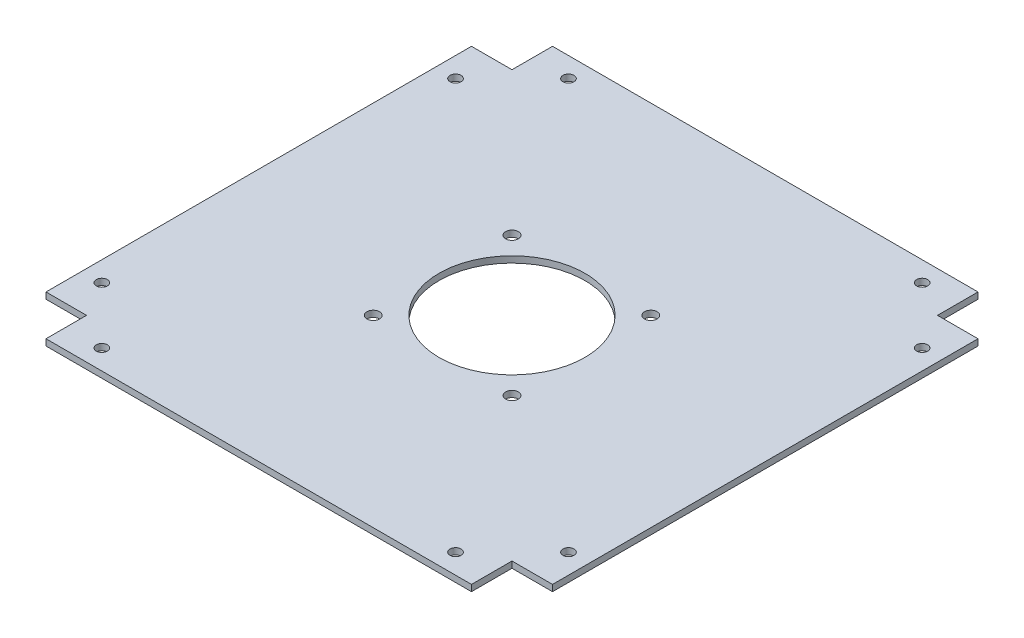
ISO-10303-21;
HEADER;
FILE_DESCRIPTION(('STEP AP214'),'2;1');
FILE_NAME('part.step','',(''),(''),'','','');
FILE_SCHEMA(('AUTOMOTIVE_DESIGN { 1 0 10303 214 1 1 1 1 }'));
ENDSEC;
DATA;
#1=APPLICATION_CONTEXT('core data for automotive mechanical design processes');
#2=APPLICATION_PROTOCOL_DEFINITION('international standard','automotive_design',2000,#1);
#3=PRODUCT_CONTEXT('',#1,'mechanical');
#4=PRODUCT('Part','Part','',(#3));
#5=PRODUCT_RELATED_PRODUCT_CATEGORY('part','',(#4));
#6=PRODUCT_DEFINITION_FORMATION('','',#4);
#7=PRODUCT_DEFINITION_CONTEXT('part definition',#1,'design');
#8=PRODUCT_DEFINITION('design','',#6,#7);
#9=PRODUCT_DEFINITION_SHAPE('','',#8);
#10=(LENGTH_UNIT() NAMED_UNIT(*) SI_UNIT(.MILLI.,.METRE.));
#11=(NAMED_UNIT(*) PLANE_ANGLE_UNIT() SI_UNIT($,.RADIAN.));
#12=(NAMED_UNIT(*) SI_UNIT($,.STERADIAN.) SOLID_ANGLE_UNIT());
#13=UNCERTAINTY_MEASURE_WITH_UNIT(LENGTH_MEASURE(1.E-05),#10,'distance_accuracy_value','');
#14=(GEOMETRIC_REPRESENTATION_CONTEXT(3) GLOBAL_UNCERTAINTY_ASSIGNED_CONTEXT((#13)) GLOBAL_UNIT_ASSIGNED_CONTEXT((#10,
#11,#12)) REPRESENTATION_CONTEXT('',''));
#15=CARTESIAN_POINT('',(0.,0.,0.));
#16=DIRECTION('',(0.,0.,1.));
#17=DIRECTION('',(1.,0.,0.));
#18=AXIS2_PLACEMENT_3D('',#15,#16,#17);
#19=CARTESIAN_POINT('',(127.,1.5875,127.));
#20=DIRECTION('',(-1.,0.,0.));
#21=DIRECTION('',(0.,0.,1.));
#22=AXIS2_PLACEMENT_3D('',#19,#20,#21);
#23=PLANE('',#22);
#24=DIRECTION('',(0.,0.,-1.));
#25=VECTOR('',#24,1.);
#26=CARTESIAN_POINT('',(127.,1.5875,127.));
#27=LINE('',#26,#25);
#28=CARTESIAN_POINT('',(126.999999999999,1.5875,106.680000000001));
#29=VERTEX_POINT('',#28);
#30=CARTESIAN_POINT('',(126.999999999999,1.5875,-106.680000000001));
#31=VERTEX_POINT('',#30);
#32=EDGE_CURVE('E165',#29,#31,#27,.T.);
#33=ORIENTED_EDGE('',*,*,#32,.F.);
#34=DIRECTION('',(0.,1.,0.));
#35=VECTOR('',#34,1.);
#36=CARTESIAN_POINT('',(126.999999999999,-1.5875,106.680000000001));
#37=LINE('',#36,#35);
#38=CARTESIAN_POINT('',(126.999999999999,-1.5875,106.680000000001));
#39=VERTEX_POINT('',#38);
#40=EDGE_CURVE('E149',#39,#29,#37,.T.);
#41=ORIENTED_EDGE('',*,*,#40,.F.);
#42=DIRECTION('',(0.,0.,-1.));
#43=VECTOR('',#42,1.);
#44=CARTESIAN_POINT('',(127.,-1.5875,127.));
#45=LINE('',#44,#43);
#46=CARTESIAN_POINT('',(126.999999999999,-1.5875,-106.680000000001));
#47=VERTEX_POINT('',#46);
#48=EDGE_CURVE('E144',#39,#47,#45,.T.);
#49=ORIENTED_EDGE('',*,*,#48,.T.);
#50=DIRECTION('',(0.,1.,0.));
#51=VECTOR('',#50,1.);
#52=CARTESIAN_POINT('',(126.999999999999,-1.5875,-106.680000000001));
#53=LINE('',#52,#51);
#54=EDGE_CURVE('E125',#47,#31,#53,.T.);
#55=ORIENTED_EDGE('',*,*,#54,.T.);
#56=EDGE_LOOP('',(#33,#41,#49,#55));
#57=FACE_BOUND('',#56,.T.);
#58=ADVANCED_FACE('F36',(#57),#23,.F.);
#59=CARTESIAN_POINT('',(-127.,1.5875,-127.));
#60=DIRECTION('',(0.,0.,1.));
#61=DIRECTION('',(1.,0.,0.));
#62=AXIS2_PLACEMENT_3D('',#59,#60,#61);
#63=PLANE('',#62);
#64=DIRECTION('',(-1.,0.,0.));
#65=VECTOR('',#64,1.);
#66=CARTESIAN_POINT('',(-127.,1.5875,-127.));
#67=LINE('',#66,#65);
#68=CARTESIAN_POINT('',(106.679999999999,1.5875,-127.000000000001));
#69=VERTEX_POINT('',#68);
#70=CARTESIAN_POINT('',(-106.68,1.5875,-127.));
#71=VERTEX_POINT('',#70);
#72=EDGE_CURVE('E170',#69,#71,#67,.T.);
#73=ORIENTED_EDGE('',*,*,#72,.F.);
#74=DIRECTION('',(0.,1.,0.));
#75=VECTOR('',#74,1.);
#76=CARTESIAN_POINT('',(106.679999999999,-1.5875,-127.000000000001));
#77=LINE('',#76,#75);
#78=CARTESIAN_POINT('',(106.679999999999,-1.5875,-127.000000000001));
#79=VERTEX_POINT('',#78);
#80=EDGE_CURVE('E136',#79,#69,#77,.T.);
#81=ORIENTED_EDGE('',*,*,#80,.F.);
#82=DIRECTION('',(-1.,0.,0.));
#83=VECTOR('',#82,1.);
#84=CARTESIAN_POINT('',(-127.,-1.5875,-127.));
#85=LINE('',#84,#83);
#86=CARTESIAN_POINT('',(-106.68,-1.5875,-127.));
#87=VERTEX_POINT('',#86);
#88=EDGE_CURVE('E150',#79,#87,#85,.T.);
#89=ORIENTED_EDGE('',*,*,#88,.T.);
#90=DIRECTION('',(0.,1.,0.));
#91=VECTOR('',#90,1.);
#92=CARTESIAN_POINT('',(-106.68,-1.5875,-127.));
#93=LINE('',#92,#91);
#94=EDGE_CURVE('E177',#87,#71,#93,.T.);
#95=ORIENTED_EDGE('',*,*,#94,.T.);
#96=EDGE_LOOP('',(#73,#81,#89,#95));
#97=FACE_BOUND('',#96,.T.);
#98=ADVANCED_FACE('F216',(#97),#63,.F.);
#99=CARTESIAN_POINT('',(-127.,1.5875,127.));
#100=DIRECTION('',(1.,0.,0.));
#101=DIRECTION('',(0.,0.,-1.));
#102=AXIS2_PLACEMENT_3D('',#99,#100,#101);
#103=PLANE('',#102);
#104=DIRECTION('',(0.,0.,1.));
#105=VECTOR('',#104,1.);
#106=CARTESIAN_POINT('',(-127.,-1.5875,127.));
#107=LINE('',#106,#105);
#108=CARTESIAN_POINT('',(-127.,-1.5875,-106.68));
#109=VERTEX_POINT('',#108);
#110=CARTESIAN_POINT('',(-127.,-1.5875,106.68));
#111=VERTEX_POINT('',#110);
#112=EDGE_CURVE('E154',#109,#111,#107,.T.);
#113=ORIENTED_EDGE('',*,*,#112,.T.);
#114=DIRECTION('',(0.,1.,0.));
#115=VECTOR('',#114,1.);
#116=CARTESIAN_POINT('',(-127.,-1.5875,106.68));
#117=LINE('',#116,#115);
#118=CARTESIAN_POINT('',(-127.,1.5875,106.68));
#119=VERTEX_POINT('',#118);
#120=EDGE_CURVE('E190',#111,#119,#117,.T.);
#121=ORIENTED_EDGE('',*,*,#120,.T.);
#122=DIRECTION('',(0.,0.,1.));
#123=VECTOR('',#122,1.);
#124=CARTESIAN_POINT('',(-127.,1.5875,127.));
#125=LINE('',#124,#123);
#126=CARTESIAN_POINT('',(-127.,1.5875,-106.68));
#127=VERTEX_POINT('',#126);
#128=EDGE_CURVE('E44',#127,#119,#125,.T.);
#129=ORIENTED_EDGE('',*,*,#128,.F.);
#130=DIRECTION('',(0.,1.,0.));
#131=VECTOR('',#130,1.);
#132=CARTESIAN_POINT('',(-127.,-1.5875,-106.68));
#133=LINE('',#132,#131);
#134=EDGE_CURVE('E156',#109,#127,#133,.T.);
#135=ORIENTED_EDGE('',*,*,#134,.F.);
#136=EDGE_LOOP('',(#113,#121,#129,#135));
#137=FACE_BOUND('',#136,.T.);
#138=ADVANCED_FACE('F189',(#137),#103,.F.);
#139=CARTESIAN_POINT('',(-127.,1.5875,127.));
#140=DIRECTION('',(0.,0.,-1.));
#141=DIRECTION('',(-1.,0.,0.));
#142=AXIS2_PLACEMENT_3D('',#139,#140,#141);
#143=PLANE('',#142);
#144=DIRECTION('',(1.,0.,0.));
#145=VECTOR('',#144,1.);
#146=CARTESIAN_POINT('',(-127.,1.5875,127.));
#147=LINE('',#146,#145);
#148=CARTESIAN_POINT('',(-106.68,1.5875,127.));
#149=VERTEX_POINT('',#148);
#150=CARTESIAN_POINT('',(106.679999999999,1.5875,127.000000000001));
#151=VERTEX_POINT('',#150);
#152=EDGE_CURVE('E11',#149,#151,#147,.T.);
#153=ORIENTED_EDGE('',*,*,#152,.F.);
#154=DIRECTION('',(0.,1.,0.));
#155=VECTOR('',#154,1.);
#156=CARTESIAN_POINT('',(-106.68,-1.5875,127.));
#157=LINE('',#156,#155);
#158=CARTESIAN_POINT('',(-106.68,-1.5875,127.));
#159=VERTEX_POINT('',#158);
#160=EDGE_CURVE('E197',#159,#149,#157,.T.);
#161=ORIENTED_EDGE('',*,*,#160,.F.);
#162=DIRECTION('',(1.,0.,0.));
#163=VECTOR('',#162,1.);
#164=CARTESIAN_POINT('',(-127.,-1.5875,127.));
#165=LINE('',#164,#163);
#166=CARTESIAN_POINT('',(106.679999999999,-1.5875,127.000000000001));
#167=VERTEX_POINT('',#166);
#168=EDGE_CURVE('E39',#159,#167,#165,.T.);
#169=ORIENTED_EDGE('',*,*,#168,.T.);
#170=DIRECTION('',(0.,1.,0.));
#171=VECTOR('',#170,1.);
#172=CARTESIAN_POINT('',(106.679999999999,-1.5875,127.000000000001));
#173=LINE('',#172,#171);
#174=EDGE_CURVE('E223',#167,#151,#173,.T.);
#175=ORIENTED_EDGE('',*,*,#174,.T.);
#176=EDGE_LOOP('',(#153,#161,#169,#175));
#177=FACE_BOUND('',#176,.T.);
#178=ADVANCED_FACE('F337',(#177),#143,.F.);
#179=CARTESIAN_POINT('',(0.,1.5875,0.));
#180=DIRECTION('',(0.,-1.,0.));
#181=DIRECTION('',(0.,0.,-1.));
#182=AXIS2_PLACEMENT_3D('',#179,#180,#181);
#183=PLANE('',#182);
#184=CARTESIAN_POINT('',(117.,1.5875,88.68));
#185=DIRECTION('',(0.,1.,0.));
#186=DIRECTION('',(0.,0.,1.));
#187=AXIS2_PLACEMENT_3D('',#184,#185,#186);
#188=CIRCLE('',#187,2.778125);
#189=CARTESIAN_POINT('',(117.,1.5875,91.458125));
#190=VERTEX_POINT('',#189);
#191=EDGE_CURVE('E295',#190,#190,#188,.T.);
#192=ORIENTED_EDGE('',*,*,#191,.F.);
#193=EDGE_LOOP('',(#192));
#194=FACE_BOUND('',#193,.T.);
#195=CARTESIAN_POINT('',(88.6800000000001,1.5875,-117.000000000001));
#196=DIRECTION('',(0.,1.,0.));
#197=DIRECTION('',(0.,0.,-1.));
#198=AXIS2_PLACEMENT_3D('',#195,#196,#197);
#199=CIRCLE('',#198,2.778125);
#200=CARTESIAN_POINT('',(88.6800000000001,1.5875,-119.778125000001));
#201=VERTEX_POINT('',#200);
#202=EDGE_CURVE('E302',#201,#201,#199,.T.);
#203=ORIENTED_EDGE('',*,*,#202,.F.);
#204=EDGE_LOOP('',(#203));
#205=FACE_BOUND('',#204,.T.);
#206=CARTESIAN_POINT('',(117.,1.5875,-88.68));
#207=DIRECTION('',(0.,1.,0.));
#208=DIRECTION('',(0.,0.,-1.));
#209=AXIS2_PLACEMENT_3D('',#206,#207,#208);
#210=CIRCLE('',#209,2.778125);
#211=CARTESIAN_POINT('',(117.,1.5875,-91.458125));
#212=VERTEX_POINT('',#211);
#213=EDGE_CURVE('E283',#212,#212,#210,.T.);
#214=ORIENTED_EDGE('',*,*,#213,.F.);
#215=EDGE_LOOP('',(#214));
#216=FACE_BOUND('',#215,.T.);
#217=CARTESIAN_POINT('',(-88.68,1.5875,-117.000000000001));
#218=DIRECTION('',(0.,1.,0.));
#219=DIRECTION('',(0.,0.,1.));
#220=AXIS2_PLACEMENT_3D('',#217,#218,#219);
#221=CIRCLE('',#220,2.778125);
#222=CARTESIAN_POINT('',(-88.68,1.5875,-114.221875000001));
#223=VERTEX_POINT('',#222);
#224=EDGE_CURVE('E290',#223,#223,#221,.T.);
#225=ORIENTED_EDGE('',*,*,#224,.F.);
#226=EDGE_LOOP('',(#225));
#227=FACE_BOUND('',#226,.T.);
#228=CARTESIAN_POINT('',(88.6800000000001,1.5875,117.000000000001));
#229=DIRECTION('',(0.,1.,0.));
#230=DIRECTION('',(0.,0.,1.));
#231=AXIS2_PLACEMENT_3D('',#228,#229,#230);
#232=CIRCLE('',#231,2.778125);
#233=CARTESIAN_POINT('',(88.6800000000001,1.5875,119.778125000001));
#234=VERTEX_POINT('',#233);
#235=EDGE_CURVE('E319',#234,#234,#232,.T.);
#236=ORIENTED_EDGE('',*,*,#235,.F.);
#237=EDGE_LOOP('',(#236));
#238=FACE_BOUND('',#237,.T.);
#239=CARTESIAN_POINT('',(-88.68,1.5875,117.000000000001));
#240=DIRECTION('',(0.,1.,0.));
#241=DIRECTION('',(0.,0.,-1.));
#242=AXIS2_PLACEMENT_3D('',#239,#240,#241);
#243=CIRCLE('',#242,2.778125);
#244=CARTESIAN_POINT('',(-88.68,1.5875,114.221875000001));
#245=VERTEX_POINT('',#244);
#246=EDGE_CURVE('E313',#245,#245,#243,.T.);
#247=ORIENTED_EDGE('',*,*,#246,.F.);
#248=EDGE_LOOP('',(#247));
#249=FACE_BOUND('',#248,.T.);
#250=CARTESIAN_POINT('',(-117.,1.5875,88.68));
#251=DIRECTION('',(0.,1.,0.));
#252=DIRECTION('',(0.,0.,-1.));
#253=AXIS2_PLACEMENT_3D('',#250,#251,#252);
#254=CIRCLE('',#253,2.778125);
#255=CARTESIAN_POINT('',(-117.,1.5875,85.901875));
#256=VERTEX_POINT('',#255);
#257=EDGE_CURVE('E307',#256,#256,#254,.T.);
#258=ORIENTED_EDGE('',*,*,#257,.F.);
#259=EDGE_LOOP('',(#258));
#260=FACE_BOUND('',#259,.T.);
#261=CARTESIAN_POINT('',(-117.,1.5875,-88.68));
#262=DIRECTION('',(0.,1.,0.));
#263=DIRECTION('',(0.,0.,1.));
#264=AXIS2_PLACEMENT_3D('',#261,#262,#263);
#265=CIRCLE('',#264,2.778125);
#266=CARTESIAN_POINT('',(-117.,1.5875,-85.901875));
#267=VERTEX_POINT('',#266);
#268=EDGE_CURVE('E277',#267,#267,#265,.T.);
#269=ORIENTED_EDGE('',*,*,#268,.F.);
#270=EDGE_LOOP('',(#269));
#271=FACE_BOUND('',#270,.T.);
#272=CARTESIAN_POINT('',(-34.80054,1.5875,34.80054));
#273=DIRECTION('',(0.,1.,0.));
#274=DIRECTION('',(0.,0.,-1.));
#275=AXIS2_PLACEMENT_3D('',#272,#273,#274);
#276=CIRCLE('',#275,3.175);
#277=CARTESIAN_POINT('',(-34.80054,1.5875,31.62554));
#278=VERTEX_POINT('',#277);
#279=EDGE_CURVE('E259',#278,#278,#276,.T.);
#280=ORIENTED_EDGE('',*,*,#279,.F.);
#281=EDGE_LOOP('',(#280));
#282=FACE_BOUND('',#281,.T.);
#283=CARTESIAN_POINT('',(34.8005399999998,1.5875,34.8005400000002));
#284=DIRECTION('',(0.,1.,0.));
#285=DIRECTION('',(0.,0.,1.));
#286=AXIS2_PLACEMENT_3D('',#283,#284,#285);
#287=CIRCLE('',#286,3.175);
#288=CARTESIAN_POINT('',(34.8005399999998,1.5875,37.9755400000002));
#289=VERTEX_POINT('',#288);
#290=EDGE_CURVE('E266',#289,#289,#287,.T.);
#291=ORIENTED_EDGE('',*,*,#290,.F.);
#292=EDGE_LOOP('',(#291));
#293=FACE_BOUND('',#292,.T.);
#294=CARTESIAN_POINT('',(34.8005399999998,1.5875,-34.8005400000002));
#295=DIRECTION('',(0.,1.,0.));
#296=DIRECTION('',(0.,0.,-1.));
#297=AXIS2_PLACEMENT_3D('',#294,#295,#296);
#298=CIRCLE('',#297,3.175);
#299=CARTESIAN_POINT('',(34.8005399999998,1.5875,-37.9755400000002));
#300=VERTEX_POINT('',#299);
#301=EDGE_CURVE('E272',#300,#300,#298,.T.);
#302=ORIENTED_EDGE('',*,*,#301,.F.);
#303=EDGE_LOOP('',(#302));
#304=FACE_BOUND('',#303,.T.);
#305=CARTESIAN_POINT('',(-34.80054,1.5875,-34.80054));
#306=DIRECTION('',(0.,1.,0.));
#307=DIRECTION('',(0.,0.,1.));
#308=AXIS2_PLACEMENT_3D('',#305,#306,#307);
#309=CIRCLE('',#308,3.175);
#310=CARTESIAN_POINT('',(-34.80054,1.5875,-31.62554));
#311=VERTEX_POINT('',#310);
#312=EDGE_CURVE('E253',#311,#311,#309,.T.);
#313=ORIENTED_EDGE('',*,*,#312,.F.);
#314=EDGE_LOOP('',(#313));
#315=FACE_BOUND('',#314,.T.);
#316=CARTESIAN_POINT('',(0.,1.5875,0.));
#317=DIRECTION('',(0.,1.,0.));
#318=DIRECTION('',(0.,0.,1.));
#319=AXIS2_PLACEMENT_3D('',#316,#317,#318);
#320=CIRCLE('',#319,36.576);
#321=CARTESIAN_POINT('',(0.,1.5875,36.576));
#322=VERTEX_POINT('',#321);
#323=EDGE_CURVE('E245',#322,#322,#320,.T.);
#324=ORIENTED_EDGE('',*,*,#323,.F.);
#325=EDGE_LOOP('',(#324));
#326=FACE_BOUND('',#325,.T.);
#327=ORIENTED_EDGE('',*,*,#128,.T.);
#328=DIRECTION('',(-1.,0.,0.));
#329=VECTOR('',#328,1.);
#330=CARTESIAN_POINT('',(-127.,1.5875,106.68));
#331=LINE('',#330,#329);
#332=CARTESIAN_POINT('',(-106.68,1.5875,106.68));
#333=VERTEX_POINT('',#332);
#334=EDGE_CURVE('E185',#333,#119,#331,.T.);
#335=ORIENTED_EDGE('',*,*,#334,.F.);
#336=DIRECTION('',(0.,0.,-1.));
#337=VECTOR('',#336,1.);
#338=CARTESIAN_POINT('',(-106.68,1.5875,106.68));
#339=LINE('',#338,#337);
#340=EDGE_CURVE('E240',#149,#333,#339,.T.);
#341=ORIENTED_EDGE('',*,*,#340,.F.);
#342=ORIENTED_EDGE('',*,*,#152,.T.);
#343=DIRECTION('',(0.,0.,1.));
#344=VECTOR('',#343,1.);
#345=CARTESIAN_POINT('',(106.679999999999,1.5875,106.680000000001));
#346=LINE('',#345,#344);
#347=CARTESIAN_POINT('',(106.679999999999,1.5875,106.680000000001));
#348=VERTEX_POINT('',#347);
#349=EDGE_CURVE('E195',#348,#151,#346,.T.);
#350=ORIENTED_EDGE('',*,*,#349,.F.);
#351=DIRECTION('',(-1.,0.,0.));
#352=VECTOR('',#351,1.);
#353=CARTESIAN_POINT('',(126.999999999999,1.5875,106.680000000001));
#354=LINE('',#353,#352);
#355=EDGE_CURVE('E191',#29,#348,#354,.T.);
#356=ORIENTED_EDGE('',*,*,#355,.F.);
#357=ORIENTED_EDGE('',*,*,#32,.T.);
#358=DIRECTION('',(1.,0.,0.));
#359=VECTOR('',#358,1.);
#360=CARTESIAN_POINT('',(126.999999999999,1.5875,-106.680000000001));
#361=LINE('',#360,#359);
#362=CARTESIAN_POINT('',(106.679999999999,1.5875,-106.680000000001));
#363=VERTEX_POINT('',#362);
#364=EDGE_CURVE('E131',#363,#31,#361,.T.);
#365=ORIENTED_EDGE('',*,*,#364,.F.);
#366=DIRECTION('',(0.,0.,1.));
#367=VECTOR('',#366,1.);
#368=CARTESIAN_POINT('',(106.679999999999,1.5875,-106.680000000001));
#369=LINE('',#368,#367);
#370=EDGE_CURVE('E146',#69,#363,#369,.T.);
#371=ORIENTED_EDGE('',*,*,#370,.F.);
#372=ORIENTED_EDGE('',*,*,#72,.T.);
#373=DIRECTION('',(0.,0.,-1.));
#374=VECTOR('',#373,1.);
#375=CARTESIAN_POINT('',(-106.68,1.5875,-106.68));
#376=LINE('',#375,#374);
#377=CARTESIAN_POINT('',(-106.68,1.5875,-106.68));
#378=VERTEX_POINT('',#377);
#379=EDGE_CURVE('E209',#378,#71,#376,.T.);
#380=ORIENTED_EDGE('',*,*,#379,.F.);
#381=DIRECTION('',(1.,0.,0.));
#382=VECTOR('',#381,1.);
#383=CARTESIAN_POINT('',(-127.,1.5875,-106.68));
#384=LINE('',#383,#382);
#385=EDGE_CURVE('E188',#127,#378,#384,.T.);
#386=ORIENTED_EDGE('',*,*,#385,.F.);
#387=EDGE_LOOP('',(#327,#335,#341,#342,#350,#356,#357,#365,#371,#372,#380,#386));
#388=FACE_BOUND('',#387,.T.);
#389=ADVANCED_FACE('F183',(#194,#205,#216,#227,#238,#249,#260,#271,#282,#293,#304,#315,#326,
#388),#183,.F.);
#390=CARTESIAN_POINT('',(0.,-1.5875,0.));
#391=DIRECTION('',(0.,-1.,0.));
#392=DIRECTION('',(0.,0.,-1.));
#393=AXIS2_PLACEMENT_3D('',#390,#391,#392);
#394=PLANE('',#393);
#395=CARTESIAN_POINT('',(117.,-1.5875,88.68));
#396=DIRECTION('',(0.,1.,0.));
#397=DIRECTION('',(0.,0.,1.));
#398=AXIS2_PLACEMENT_3D('',#395,#396,#397);
#399=CIRCLE('',#398,2.778125);
#400=CARTESIAN_POINT('',(117.,-1.5875,91.458125));
#401=VERTEX_POINT('',#400);
#402=EDGE_CURVE('E298',#401,#401,#399,.T.);
#403=ORIENTED_EDGE('',*,*,#402,.T.);
#404=EDGE_LOOP('',(#403));
#405=FACE_BOUND('',#404,.T.);
#406=CARTESIAN_POINT('',(88.6800000000001,-1.5875,-117.000000000001));
#407=DIRECTION('',(0.,1.,0.));
#408=DIRECTION('',(0.,0.,-1.));
#409=AXIS2_PLACEMENT_3D('',#406,#407,#408);
#410=CIRCLE('',#409,2.778125);
#411=CARTESIAN_POINT('',(88.6800000000001,-1.5875,-119.778125000001));
#412=VERTEX_POINT('',#411);
#413=EDGE_CURVE('E287',#412,#412,#410,.T.);
#414=ORIENTED_EDGE('',*,*,#413,.T.);
#415=EDGE_LOOP('',(#414));
#416=FACE_BOUND('',#415,.T.);
#417=CARTESIAN_POINT('',(117.,-1.5875,-88.68));
#418=DIRECTION('',(0.,1.,0.));
#419=DIRECTION('',(0.,0.,-1.));
#420=AXIS2_PLACEMENT_3D('',#417,#418,#419);
#421=CIRCLE('',#420,2.778125);
#422=CARTESIAN_POINT('',(117.,-1.5875,-91.458125));
#423=VERTEX_POINT('',#422);
#424=EDGE_CURVE('E286',#423,#423,#421,.T.);
#425=ORIENTED_EDGE('',*,*,#424,.T.);
#426=EDGE_LOOP('',(#425));
#427=FACE_BOUND('',#426,.T.);
#428=CARTESIAN_POINT('',(-88.68,-1.5875,-117.000000000001));
#429=DIRECTION('',(0.,1.,0.));
#430=DIRECTION('',(0.,0.,1.));
#431=AXIS2_PLACEMENT_3D('',#428,#429,#430);
#432=CIRCLE('',#431,2.778125);
#433=CARTESIAN_POINT('',(-88.68,-1.5875,-114.221875000001));
#434=VERTEX_POINT('',#433);
#435=EDGE_CURVE('E280',#434,#434,#432,.T.);
#436=ORIENTED_EDGE('',*,*,#435,.T.);
#437=EDGE_LOOP('',(#436));
#438=FACE_BOUND('',#437,.T.);
#439=CARTESIAN_POINT('',(88.6800000000001,-1.5875,117.000000000001));
#440=DIRECTION('',(0.,1.,0.));
#441=DIRECTION('',(0.,0.,1.));
#442=AXIS2_PLACEMENT_3D('',#439,#440,#441);
#443=CIRCLE('',#442,2.778125);
#444=CARTESIAN_POINT('',(88.6800000000001,-1.5875,119.778125000001));
#445=VERTEX_POINT('',#444);
#446=EDGE_CURVE('E299',#445,#445,#443,.T.);
#447=ORIENTED_EDGE('',*,*,#446,.T.);
#448=EDGE_LOOP('',(#447));
#449=FACE_BOUND('',#448,.T.);
#450=CARTESIAN_POINT('',(-88.68,-1.5875,117.000000000001));
#451=DIRECTION('',(0.,1.,0.));
#452=DIRECTION('',(0.,0.,-1.));
#453=AXIS2_PLACEMENT_3D('',#450,#451,#452);
#454=CIRCLE('',#453,2.778125);
#455=CARTESIAN_POINT('',(-88.68,-1.5875,114.221875000001));
#456=VERTEX_POINT('',#455);
#457=EDGE_CURVE('E316',#456,#456,#454,.T.);
#458=ORIENTED_EDGE('',*,*,#457,.T.);
#459=EDGE_LOOP('',(#458));
#460=FACE_BOUND('',#459,.T.);
#461=CARTESIAN_POINT('',(-117.,-1.5875,88.68));
#462=DIRECTION('',(0.,1.,0.));
#463=DIRECTION('',(0.,0.,-1.));
#464=AXIS2_PLACEMENT_3D('',#461,#462,#463);
#465=CIRCLE('',#464,2.778125);
#466=CARTESIAN_POINT('',(-117.,-1.5875,85.901875));
#467=VERTEX_POINT('',#466);
#468=EDGE_CURVE('E310',#467,#467,#465,.T.);
#469=ORIENTED_EDGE('',*,*,#468,.T.);
#470=EDGE_LOOP('',(#469));
#471=FACE_BOUND('',#470,.T.);
#472=CARTESIAN_POINT('',(-117.,-1.5875,-88.68));
#473=DIRECTION('',(0.,1.,0.));
#474=DIRECTION('',(0.,0.,1.));
#475=AXIS2_PLACEMENT_3D('',#472,#473,#474);
#476=CIRCLE('',#475,2.778125);
#477=CARTESIAN_POINT('',(-117.,-1.5875,-85.901875));
#478=VERTEX_POINT('',#477);
#479=EDGE_CURVE('E263',#478,#478,#476,.T.);
#480=ORIENTED_EDGE('',*,*,#479,.T.);
#481=EDGE_LOOP('',(#480));
#482=FACE_BOUND('',#481,.T.);
#483=CARTESIAN_POINT('',(-34.80054,-1.5875,34.80054));
#484=DIRECTION('',(0.,1.,0.));
#485=DIRECTION('',(0.,0.,-1.));
#486=AXIS2_PLACEMENT_3D('',#483,#484,#485);
#487=CIRCLE('',#486,3.175);
#488=CARTESIAN_POINT('',(-34.80054,-1.5875,31.62554));
#489=VERTEX_POINT('',#488);
#490=EDGE_CURVE('E262',#489,#489,#487,.T.);
#491=ORIENTED_EDGE('',*,*,#490,.T.);
#492=EDGE_LOOP('',(#491));
#493=FACE_BOUND('',#492,.T.);
#494=CARTESIAN_POINT('',(34.8005399999998,-1.5875,34.8005400000002));
#495=DIRECTION('',(0.,1.,0.));
#496=DIRECTION('',(0.,0.,1.));
#497=AXIS2_PLACEMENT_3D('',#494,#495,#496);
#498=CIRCLE('',#497,3.175);
#499=CARTESIAN_POINT('',(34.8005399999998,-1.5875,37.9755400000002));
#500=VERTEX_POINT('',#499);
#501=EDGE_CURVE('E269',#500,#500,#498,.T.);
#502=ORIENTED_EDGE('',*,*,#501,.T.);
#503=EDGE_LOOP('',(#502));
#504=FACE_BOUND('',#503,.T.);
#505=CARTESIAN_POINT('',(34.8005399999998,-1.5875,-34.8005400000002));
#506=DIRECTION('',(0.,1.,0.));
#507=DIRECTION('',(0.,0.,-1.));
#508=AXIS2_PLACEMENT_3D('',#505,#506,#507);
#509=CIRCLE('',#508,3.175);
#510=CARTESIAN_POINT('',(34.8005399999998,-1.5875,-37.9755400000002));
#511=VERTEX_POINT('',#510);
#512=EDGE_CURVE('E256',#511,#511,#509,.T.);
#513=ORIENTED_EDGE('',*,*,#512,.T.);
#514=EDGE_LOOP('',(#513));
#515=FACE_BOUND('',#514,.T.);
#516=CARTESIAN_POINT('',(-34.80054,-1.5875,-34.80054));
#517=DIRECTION('',(0.,1.,0.));
#518=DIRECTION('',(0.,0.,1.));
#519=AXIS2_PLACEMENT_3D('',#516,#517,#518);
#520=CIRCLE('',#519,3.175);
#521=CARTESIAN_POINT('',(-34.80054,-1.5875,-31.62554));
#522=VERTEX_POINT('',#521);
#523=EDGE_CURVE('E250',#522,#522,#520,.T.);
#524=ORIENTED_EDGE('',*,*,#523,.T.);
#525=EDGE_LOOP('',(#524));
#526=FACE_BOUND('',#525,.T.);
#527=CARTESIAN_POINT('',(0.,-1.5875,0.));
#528=DIRECTION('',(0.,1.,0.));
#529=DIRECTION('',(0.,0.,1.));
#530=AXIS2_PLACEMENT_3D('',#527,#528,#529);
#531=CIRCLE('',#530,36.576);
#532=CARTESIAN_POINT('',(0.,-1.5875,36.576));
#533=VERTEX_POINT('',#532);
#534=EDGE_CURVE('E242',#533,#533,#531,.T.);
#535=ORIENTED_EDGE('',*,*,#534,.T.);
#536=EDGE_LOOP('',(#535));
#537=FACE_BOUND('',#536,.T.);
#538=DIRECTION('',(-1.,0.,0.));
#539=VECTOR('',#538,1.);
#540=CARTESIAN_POINT('',(-127.,-1.5875,106.68));
#541=LINE('',#540,#539);
#542=CARTESIAN_POINT('',(-106.68,-1.5875,106.68));
#543=VERTEX_POINT('',#542);
#544=EDGE_CURVE('E52',#543,#111,#541,.T.);
#545=ORIENTED_EDGE('',*,*,#544,.T.);
#546=ORIENTED_EDGE('',*,*,#112,.F.);
#547=DIRECTION('',(1.,0.,0.));
#548=VECTOR('',#547,1.);
#549=CARTESIAN_POINT('',(-127.,-1.5875,-106.68));
#550=LINE('',#549,#548);
#551=CARTESIAN_POINT('',(-106.68,-1.5875,-106.68));
#552=VERTEX_POINT('',#551);
#553=EDGE_CURVE('E206',#109,#552,#550,.T.);
#554=ORIENTED_EDGE('',*,*,#553,.T.);
#555=DIRECTION('',(0.,0.,-1.));
#556=VECTOR('',#555,1.);
#557=CARTESIAN_POINT('',(-106.68,-1.5875,-106.68));
#558=LINE('',#557,#556);
#559=EDGE_CURVE('E203',#552,#87,#558,.T.);
#560=ORIENTED_EDGE('',*,*,#559,.T.);
#561=ORIENTED_EDGE('',*,*,#88,.F.);
#562=DIRECTION('',(0.,0.,1.));
#563=VECTOR('',#562,1.);
#564=CARTESIAN_POINT('',(106.679999999999,-1.5875,-106.680000000001));
#565=LINE('',#564,#563);
#566=CARTESIAN_POINT('',(106.679999999999,-1.5875,-106.680000000001));
#567=VERTEX_POINT('',#566);
#568=EDGE_CURVE('E137',#79,#567,#565,.T.);
#569=ORIENTED_EDGE('',*,*,#568,.T.);
#570=DIRECTION('',(1.,0.,0.));
#571=VECTOR('',#570,1.);
#572=CARTESIAN_POINT('',(126.999999999999,-1.5875,-106.680000000001));
#573=LINE('',#572,#571);
#574=EDGE_CURVE('E128',#567,#47,#573,.T.);
#575=ORIENTED_EDGE('',*,*,#574,.T.);
#576=ORIENTED_EDGE('',*,*,#48,.F.);
#577=DIRECTION('',(-1.,0.,0.));
#578=VECTOR('',#577,1.);
#579=CARTESIAN_POINT('',(126.999999999999,-1.5875,106.680000000001));
#580=LINE('',#579,#578);
#581=CARTESIAN_POINT('',(106.679999999999,-1.5875,106.680000000001));
#582=VERTEX_POINT('',#581);
#583=EDGE_CURVE('E229',#39,#582,#580,.T.);
#584=ORIENTED_EDGE('',*,*,#583,.T.);
#585=DIRECTION('',(0.,0.,1.));
#586=VECTOR('',#585,1.);
#587=CARTESIAN_POINT('',(106.679999999999,-1.5875,106.680000000001));
#588=LINE('',#587,#586);
#589=EDGE_CURVE('E60',#582,#167,#588,.T.);
#590=ORIENTED_EDGE('',*,*,#589,.T.);
#591=ORIENTED_EDGE('',*,*,#168,.F.);
#592=DIRECTION('',(0.,0.,-1.));
#593=VECTOR('',#592,1.);
#594=CARTESIAN_POINT('',(-106.68,-1.5875,106.68));
#595=LINE('',#594,#593);
#596=EDGE_CURVE('E237',#159,#543,#595,.T.);
#597=ORIENTED_EDGE('',*,*,#596,.T.);
#598=EDGE_LOOP('',(#545,#546,#554,#560,#561,#569,#575,#576,#584,#590,#591,#597));
#599=FACE_BOUND('',#598,.T.);
#600=ADVANCED_FACE('F142',(#405,#416,#427,#438,#449,#460,#471,#482,#493,#504,#515,#526,#537,
#599),#394,.T.);
#601=CARTESIAN_POINT('',(-106.68,-1.5875,-106.68));
#602=DIRECTION('',(1.,0.,0.));
#603=DIRECTION('',(0.,0.,-1.));
#604=AXIS2_PLACEMENT_3D('',#601,#602,#603);
#605=PLANE('',#604);
#606=ORIENTED_EDGE('',*,*,#379,.T.);
#607=ORIENTED_EDGE('',*,*,#94,.F.);
#608=ORIENTED_EDGE('',*,*,#559,.F.);
#609=DIRECTION('',(0.,1.,0.));
#610=VECTOR('',#609,1.);
#611=CARTESIAN_POINT('',(-106.68,-1.5875,-106.68));
#612=LINE('',#611,#610);
#613=EDGE_CURVE('E151',#552,#378,#612,.T.);
#614=ORIENTED_EDGE('',*,*,#613,.T.);
#615=EDGE_LOOP('',(#606,#607,#608,#614));
#616=FACE_BOUND('',#615,.T.);
#617=ADVANCED_FACE('F384',(#616),#605,.F.);
#618=CARTESIAN_POINT('',(-127.,-1.5875,-106.68));
#619=DIRECTION('',(0.,0.,1.));
#620=DIRECTION('',(1.,0.,0.));
#621=AXIS2_PLACEMENT_3D('',#618,#619,#620);
#622=PLANE('',#621);
#623=ORIENTED_EDGE('',*,*,#385,.T.);
#624=ORIENTED_EDGE('',*,*,#613,.F.);
#625=ORIENTED_EDGE('',*,*,#553,.F.);
#626=ORIENTED_EDGE('',*,*,#134,.T.);
#627=EDGE_LOOP('',(#623,#624,#625,#626));
#628=FACE_BOUND('',#627,.T.);
#629=ADVANCED_FACE('F389',(#628),#622,.F.);
#630=CARTESIAN_POINT('',(126.999999999999,-1.5875,-106.680000000001));
#631=DIRECTION('',(0.,0.,1.));
#632=DIRECTION('',(1.,0.,0.));
#633=AXIS2_PLACEMENT_3D('',#630,#631,#632);
#634=PLANE('',#633);
#635=ORIENTED_EDGE('',*,*,#364,.T.);
#636=ORIENTED_EDGE('',*,*,#54,.F.);
#637=ORIENTED_EDGE('',*,*,#574,.F.);
#638=DIRECTION('',(0.,1.,0.));
#639=VECTOR('',#638,1.);
#640=CARTESIAN_POINT('',(106.679999999999,-1.5875,-106.680000000001));
#641=LINE('',#640,#639);
#642=EDGE_CURVE('E211',#567,#363,#641,.T.);
#643=ORIENTED_EDGE('',*,*,#642,.T.);
#644=EDGE_LOOP('',(#635,#636,#637,#643));
#645=FACE_BOUND('',#644,.T.);
#646=ADVANCED_FACE('F127',(#645),#634,.F.);
#647=CARTESIAN_POINT('',(106.679999999999,-1.5875,-106.680000000001));
#648=DIRECTION('',(-1.,0.,0.));
#649=DIRECTION('',(0.,0.,1.));
#650=AXIS2_PLACEMENT_3D('',#647,#648,#649);
#651=PLANE('',#650);
#652=ORIENTED_EDGE('',*,*,#370,.T.);
#653=ORIENTED_EDGE('',*,*,#642,.F.);
#654=ORIENTED_EDGE('',*,*,#568,.F.);
#655=ORIENTED_EDGE('',*,*,#80,.T.);
#656=EDGE_LOOP('',(#652,#653,#654,#655));
#657=FACE_BOUND('',#656,.T.);
#658=ADVANCED_FACE('F401',(#657),#651,.F.);
#659=CARTESIAN_POINT('',(106.679999999999,-1.5875,106.680000000001));
#660=DIRECTION('',(-1.,0.,0.));
#661=DIRECTION('',(0.,0.,1.));
#662=AXIS2_PLACEMENT_3D('',#659,#660,#661);
#663=PLANE('',#662);
#664=ORIENTED_EDGE('',*,*,#349,.T.);
#665=ORIENTED_EDGE('',*,*,#174,.F.);
#666=ORIENTED_EDGE('',*,*,#589,.F.);
#667=DIRECTION('',(0.,1.,0.));
#668=VECTOR('',#667,1.);
#669=CARTESIAN_POINT('',(106.679999999999,-1.5875,106.680000000001));
#670=LINE('',#669,#668);
#671=EDGE_CURVE('E234',#582,#348,#670,.T.);
#672=ORIENTED_EDGE('',*,*,#671,.T.);
#673=EDGE_LOOP('',(#664,#665,#666,#672));
#674=FACE_BOUND('',#673,.T.);
#675=ADVANCED_FACE('F397',(#674),#663,.F.);
#676=CARTESIAN_POINT('',(126.999999999999,-1.5875,106.680000000001));
#677=DIRECTION('',(0.,0.,-1.));
#678=DIRECTION('',(-1.,0.,0.));
#679=AXIS2_PLACEMENT_3D('',#676,#677,#678);
#680=PLANE('',#679);
#681=ORIENTED_EDGE('',*,*,#355,.T.);
#682=ORIENTED_EDGE('',*,*,#671,.F.);
#683=ORIENTED_EDGE('',*,*,#583,.F.);
#684=ORIENTED_EDGE('',*,*,#40,.T.);
#685=EDGE_LOOP('',(#681,#682,#683,#684));
#686=FACE_BOUND('',#685,.T.);
#687=ADVANCED_FACE('F394',(#686),#680,.F.);
#688=CARTESIAN_POINT('',(-127.,-1.5875,106.68));
#689=DIRECTION('',(0.,0.,-1.));
#690=DIRECTION('',(-1.,0.,0.));
#691=AXIS2_PLACEMENT_3D('',#688,#689,#690);
#692=PLANE('',#691);
#693=ORIENTED_EDGE('',*,*,#334,.T.);
#694=ORIENTED_EDGE('',*,*,#120,.F.);
#695=ORIENTED_EDGE('',*,*,#544,.F.);
#696=DIRECTION('',(0.,1.,0.));
#697=VECTOR('',#696,1.);
#698=CARTESIAN_POINT('',(-106.68,-1.5875,106.68));
#699=LINE('',#698,#697);
#700=EDGE_CURVE('E192',#543,#333,#699,.T.);
#701=ORIENTED_EDGE('',*,*,#700,.T.);
#702=EDGE_LOOP('',(#693,#694,#695,#701));
#703=FACE_BOUND('',#702,.T.);
#704=ADVANCED_FACE('F369',(#703),#692,.F.);
#705=CARTESIAN_POINT('',(-106.68,-1.5875,106.68));
#706=DIRECTION('',(1.,0.,0.));
#707=DIRECTION('',(0.,0.,-1.));
#708=AXIS2_PLACEMENT_3D('',#705,#706,#707);
#709=PLANE('',#708);
#710=ORIENTED_EDGE('',*,*,#340,.T.);
#711=ORIENTED_EDGE('',*,*,#700,.F.);
#712=ORIENTED_EDGE('',*,*,#596,.F.);
#713=ORIENTED_EDGE('',*,*,#160,.T.);
#714=EDGE_LOOP('',(#710,#711,#712,#713));
#715=FACE_BOUND('',#714,.T.);
#716=ADVANCED_FACE('F359',(#715),#709,.F.);
#717=CARTESIAN_POINT('',(0.,-1.5875,0.));
#718=DIRECTION('',(0.,1.,0.));
#719=DIRECTION('',(0.,0.,1.));
#720=AXIS2_PLACEMENT_3D('',#717,#718,#719);
#721=CYLINDRICAL_SURFACE('',#720,36.576);
#722=ORIENTED_EDGE('',*,*,#534,.F.);
#723=EDGE_LOOP('',(#722));
#724=FACE_BOUND('',#723,.T.);
#725=ORIENTED_EDGE('',*,*,#323,.T.);
#726=EDGE_LOOP('',(#725));
#727=FACE_BOUND('',#726,.T.);
#728=ADVANCED_FACE('F356',(#724,#727),#721,.F.);
#729=CARTESIAN_POINT('',(-34.80054,-1.5875,-34.80054));
#730=DIRECTION('',(0.,1.,0.));
#731=DIRECTION('',(0.,0.,1.));
#732=AXIS2_PLACEMENT_3D('',#729,#730,#731);
#733=CYLINDRICAL_SURFACE('',#732,3.175);
#734=ORIENTED_EDGE('',*,*,#523,.F.);
#735=EDGE_LOOP('',(#734));
#736=FACE_BOUND('',#735,.T.);
#737=ORIENTED_EDGE('',*,*,#312,.T.);
#738=EDGE_LOOP('',(#737));
#739=FACE_BOUND('',#738,.T.);
#740=ADVANCED_FACE('F358',(#736,#739),#733,.F.);
#741=CARTESIAN_POINT('',(34.8005399999998,-1.5875,-34.8005400000002));
#742=DIRECTION('',(0.,1.,0.));
#743=DIRECTION('',(0.,0.,1.));
#744=AXIS2_PLACEMENT_3D('',#741,#742,#743);
#745=CYLINDRICAL_SURFACE('',#744,3.175);
#746=ORIENTED_EDGE('',*,*,#512,.F.);
#747=EDGE_LOOP('',(#746));
#748=FACE_BOUND('',#747,.T.);
#749=ORIENTED_EDGE('',*,*,#301,.T.);
#750=EDGE_LOOP('',(#749));
#751=FACE_BOUND('',#750,.T.);
#752=ADVANCED_FACE('F366',(#748,#751),#745,.F.);
#753=CARTESIAN_POINT('',(34.8005399999998,-1.5875,34.8005400000002));
#754=DIRECTION('',(0.,1.,0.));
#755=DIRECTION('',(0.,0.,1.));
#756=AXIS2_PLACEMENT_3D('',#753,#754,#755);
#757=CYLINDRICAL_SURFACE('',#756,3.175);
#758=ORIENTED_EDGE('',*,*,#501,.F.);
#759=EDGE_LOOP('',(#758));
#760=FACE_BOUND('',#759,.T.);
#761=ORIENTED_EDGE('',*,*,#290,.T.);
#762=EDGE_LOOP('',(#761));
#763=FACE_BOUND('',#762,.T.);
#764=ADVANCED_FACE('F443',(#760,#763),#757,.F.);
#765=CARTESIAN_POINT('',(-34.80054,-1.5875,34.80054));
#766=DIRECTION('',(0.,1.,0.));
#767=DIRECTION('',(0.,0.,1.));
#768=AXIS2_PLACEMENT_3D('',#765,#766,#767);
#769=CYLINDRICAL_SURFACE('',#768,3.175);
#770=ORIENTED_EDGE('',*,*,#490,.F.);
#771=EDGE_LOOP('',(#770));
#772=FACE_BOUND('',#771,.T.);
#773=ORIENTED_EDGE('',*,*,#279,.T.);
#774=EDGE_LOOP('',(#773));
#775=FACE_BOUND('',#774,.T.);
#776=ADVANCED_FACE('F453',(#772,#775),#769,.F.);
#777=CARTESIAN_POINT('',(-117.,-1.5875,-88.68));
#778=DIRECTION('',(0.,1.,0.));
#779=DIRECTION('',(0.,0.,1.));
#780=AXIS2_PLACEMENT_3D('',#777,#778,#779);
#781=CYLINDRICAL_SURFACE('',#780,2.778125);
#782=ORIENTED_EDGE('',*,*,#479,.F.);
#783=EDGE_LOOP('',(#782));
#784=FACE_BOUND('',#783,.T.);
#785=ORIENTED_EDGE('',*,*,#268,.T.);
#786=EDGE_LOOP('',(#785));
#787=FACE_BOUND('',#786,.T.);
#788=ADVANCED_FACE('F463',(#784,#787),#781,.F.);
#789=CARTESIAN_POINT('',(-117.,-1.5875,88.68));
#790=DIRECTION('',(0.,1.,0.));
#791=DIRECTION('',(0.,0.,1.));
#792=AXIS2_PLACEMENT_3D('',#789,#790,#791);
#793=CYLINDRICAL_SURFACE('',#792,2.778125);
#794=ORIENTED_EDGE('',*,*,#468,.F.);
#795=EDGE_LOOP('',(#794));
#796=FACE_BOUND('',#795,.T.);
#797=ORIENTED_EDGE('',*,*,#257,.T.);
#798=EDGE_LOOP('',(#797));
#799=FACE_BOUND('',#798,.T.);
#800=ADVANCED_FACE('F487',(#796,#799),#793,.F.);
#801=CARTESIAN_POINT('',(-88.68,-1.5875,117.000000000001));
#802=DIRECTION('',(0.,1.,0.));
#803=DIRECTION('',(0.,0.,1.));
#804=AXIS2_PLACEMENT_3D('',#801,#802,#803);
#805=CYLINDRICAL_SURFACE('',#804,2.778125);
#806=ORIENTED_EDGE('',*,*,#457,.F.);
#807=EDGE_LOOP('',(#806));
#808=FACE_BOUND('',#807,.T.);
#809=ORIENTED_EDGE('',*,*,#246,.T.);
#810=EDGE_LOOP('',(#809));
#811=FACE_BOUND('',#810,.T.);
#812=ADVANCED_FACE('F331',(#808,#811),#805,.F.);
#813=CARTESIAN_POINT('',(88.6800000000001,-1.5875,117.000000000001));
#814=DIRECTION('',(0.,1.,0.));
#815=DIRECTION('',(0.,0.,1.));
#816=AXIS2_PLACEMENT_3D('',#813,#814,#815);
#817=CYLINDRICAL_SURFACE('',#816,2.778125);
#818=ORIENTED_EDGE('',*,*,#446,.F.);
#819=EDGE_LOOP('',(#818));
#820=FACE_BOUND('',#819,.T.);
#821=ORIENTED_EDGE('',*,*,#235,.T.);
#822=EDGE_LOOP('',(#821));
#823=FACE_BOUND('',#822,.T.);
#824=ADVANCED_FACE('F327',(#820,#823),#817,.F.);
#825=CARTESIAN_POINT('',(-88.68,-1.5875,-117.000000000001));
#826=DIRECTION('',(0.,1.,0.));
#827=DIRECTION('',(0.,0.,1.));
#828=AXIS2_PLACEMENT_3D('',#825,#826,#827);
#829=CYLINDRICAL_SURFACE('',#828,2.778125);
#830=ORIENTED_EDGE('',*,*,#435,.F.);
#831=EDGE_LOOP('',(#830));
#832=FACE_BOUND('',#831,.T.);
#833=ORIENTED_EDGE('',*,*,#224,.T.);
#834=EDGE_LOOP('',(#833));
#835=FACE_BOUND('',#834,.T.);
#836=ADVANCED_FACE('F330',(#832,#835),#829,.F.);
#837=CARTESIAN_POINT('',(117.,-1.5875,-88.68));
#838=DIRECTION('',(0.,1.,0.));
#839=DIRECTION('',(0.,0.,1.));
#840=AXIS2_PLACEMENT_3D('',#837,#838,#839);
#841=CYLINDRICAL_SURFACE('',#840,2.778125);
#842=ORIENTED_EDGE('',*,*,#424,.F.);
#843=EDGE_LOOP('',(#842));
#844=FACE_BOUND('',#843,.T.);
#845=ORIENTED_EDGE('',*,*,#213,.T.);
#846=EDGE_LOOP('',(#845));
#847=FACE_BOUND('',#846,.T.);
#848=ADVANCED_FACE('F521',(#844,#847),#841,.F.);
#849=CARTESIAN_POINT('',(88.6800000000001,-1.5875,-117.000000000001));
#850=DIRECTION('',(0.,1.,0.));
#851=DIRECTION('',(0.,0.,1.));
#852=AXIS2_PLACEMENT_3D('',#849,#850,#851);
#853=CYLINDRICAL_SURFACE('',#852,2.778125);
#854=ORIENTED_EDGE('',*,*,#413,.F.);
#855=EDGE_LOOP('',(#854));
#856=FACE_BOUND('',#855,.T.);
#857=ORIENTED_EDGE('',*,*,#202,.T.);
#858=EDGE_LOOP('',(#857));
#859=FACE_BOUND('',#858,.T.);
#860=ADVANCED_FACE('F531',(#856,#859),#853,.F.);
#861=CARTESIAN_POINT('',(117.,-1.5875,88.68));
#862=DIRECTION('',(0.,1.,0.));
#863=DIRECTION('',(0.,0.,1.));
#864=AXIS2_PLACEMENT_3D('',#861,#862,#863);
#865=CYLINDRICAL_SURFACE('',#864,2.778125);
#866=ORIENTED_EDGE('',*,*,#402,.F.);
#867=EDGE_LOOP('',(#866));
#868=FACE_BOUND('',#867,.T.);
#869=ORIENTED_EDGE('',*,*,#191,.T.);
#870=EDGE_LOOP('',(#869));
#871=FACE_BOUND('',#870,.T.);
#872=ADVANCED_FACE('F541',(#868,#871),#865,.F.);
#873=CLOSED_SHELL('',(#58,#98,#138,#178,#389,#600,#617,#629,#646,#658,#675,#687,#704,#716,#728,
#740,#752,#764,#776,#788,#800,#812,#824,#836,#848,#860,#872));
#874=MANIFOLD_SOLID_BREP('B2',#873);
#875=ADVANCED_BREP_SHAPE_REPRESENTATION('',(#18,#874),#14);
#876=SHAPE_DEFINITION_REPRESENTATION(#9,#875);
ENDSEC;
END-ISO-10303-21;
